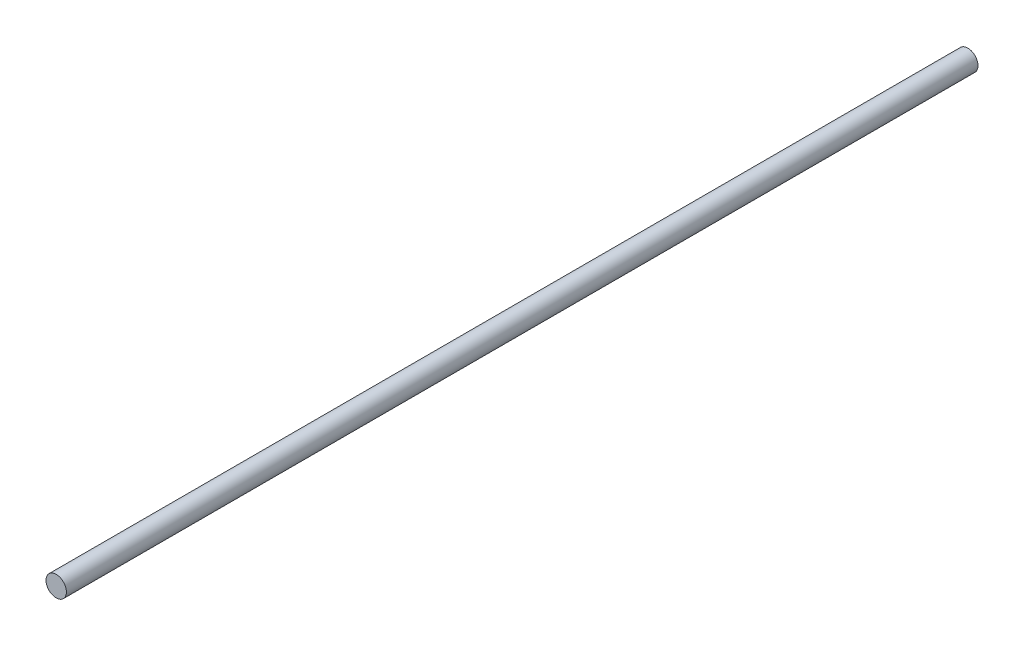
ISO-10303-21;
HEADER;
FILE_DESCRIPTION(('STEP AP214'),'2;1');
FILE_NAME('part.step','',(''),(''),'','','');
FILE_SCHEMA(('AUTOMOTIVE_DESIGN { 1 0 10303 214 1 1 1 1 }'));
ENDSEC;
DATA;
#1=APPLICATION_CONTEXT('core data for automotive mechanical design processes');
#2=APPLICATION_PROTOCOL_DEFINITION('international standard','automotive_design',2000,#1);
#3=PRODUCT_CONTEXT('',#1,'mechanical');
#4=PRODUCT('Part','Part','',(#3));
#5=PRODUCT_RELATED_PRODUCT_CATEGORY('part','',(#4));
#6=PRODUCT_DEFINITION_FORMATION('','',#4);
#7=PRODUCT_DEFINITION_CONTEXT('part definition',#1,'design');
#8=PRODUCT_DEFINITION('design','',#6,#7);
#9=PRODUCT_DEFINITION_SHAPE('','',#8);
#10=(LENGTH_UNIT() NAMED_UNIT(*) SI_UNIT(.MILLI.,.METRE.));
#11=(NAMED_UNIT(*) PLANE_ANGLE_UNIT() SI_UNIT($,.RADIAN.));
#12=(NAMED_UNIT(*) SI_UNIT($,.STERADIAN.) SOLID_ANGLE_UNIT());
#13=UNCERTAINTY_MEASURE_WITH_UNIT(LENGTH_MEASURE(1.E-05),#10,'distance_accuracy_value','');
#14=(GEOMETRIC_REPRESENTATION_CONTEXT(3) GLOBAL_UNCERTAINTY_ASSIGNED_CONTEXT((#13)) GLOBAL_UNIT_ASSIGNED_CONTEXT((#10,
#11,#12)) REPRESENTATION_CONTEXT('',''));
#15=CARTESIAN_POINT('',(0.,0.,0.));
#16=DIRECTION('',(0.,0.,1.));
#17=DIRECTION('',(1.,0.,0.));
#18=AXIS2_PLACEMENT_3D('',#15,#16,#17);
#19=CARTESIAN_POINT('',(0.,0.,134.));
#20=DIRECTION('',(0.,0.,-1.));
#21=DIRECTION('',(-1.,0.,0.));
#22=AXIS2_PLACEMENT_3D('',#19,#20,#21);
#23=CYLINDRICAL_SURFACE('',#22,1.5);
#24=CARTESIAN_POINT('',(0.,0.,134.));
#25=DIRECTION('',(0.,0.,1.));
#26=DIRECTION('',(1.,0.,0.));
#27=AXIS2_PLACEMENT_3D('',#24,#25,#26);
#28=CIRCLE('',#27,1.5);
#29=CARTESIAN_POINT('',(1.5,0.,134.));
#30=VERTEX_POINT('',#29);
#31=EDGE_CURVE('E10',#30,#30,#28,.T.);
#32=ORIENTED_EDGE('',*,*,#31,.F.);
#33=EDGE_LOOP('',(#32));
#34=FACE_BOUND('',#33,.T.);
#35=CARTESIAN_POINT('',(0.,0.,0.));
#36=DIRECTION('',(0.,0.,1.));
#37=DIRECTION('',(1.,0.,0.));
#38=AXIS2_PLACEMENT_3D('',#35,#36,#37);
#39=CIRCLE('',#38,1.5);
#40=CARTESIAN_POINT('',(1.5,0.,0.));
#41=VERTEX_POINT('',#40);
#42=EDGE_CURVE('E34',#41,#41,#39,.T.);
#43=ORIENTED_EDGE('',*,*,#42,.T.);
#44=EDGE_LOOP('',(#43));
#45=FACE_BOUND('',#44,.T.);
#46=ADVANCED_FACE('F31',(#34,#45),#23,.T.);
#47=CARTESIAN_POINT('',(0.,0.,134.));
#48=DIRECTION('',(0.,0.,1.));
#49=DIRECTION('',(1.,0.,0.));
#50=AXIS2_PLACEMENT_3D('',#47,#48,#49);
#51=PLANE('',#50);
#52=ORIENTED_EDGE('',*,*,#31,.T.);
#53=EDGE_LOOP('',(#52));
#54=FACE_BOUND('',#53,.T.);
#55=ADVANCED_FACE('F46',(#54),#51,.T.);
#56=CARTESIAN_POINT('',(0.,0.,0.));
#57=DIRECTION('',(0.,0.,1.));
#58=DIRECTION('',(1.,0.,0.));
#59=AXIS2_PLACEMENT_3D('',#56,#57,#58);
#60=PLANE('',#59);
#61=ORIENTED_EDGE('',*,*,#42,.F.);
#62=EDGE_LOOP('',(#61));
#63=FACE_BOUND('',#62,.T.);
#64=ADVANCED_FACE('F44',(#63),#60,.F.);
#65=CLOSED_SHELL('',(#46,#55,#64));
#66=MANIFOLD_SOLID_BREP('B2',#65);
#67=ADVANCED_BREP_SHAPE_REPRESENTATION('',(#18,#66),#14);
#68=SHAPE_DEFINITION_REPRESENTATION(#9,#67);
ENDSEC;
END-ISO-10303-21;
